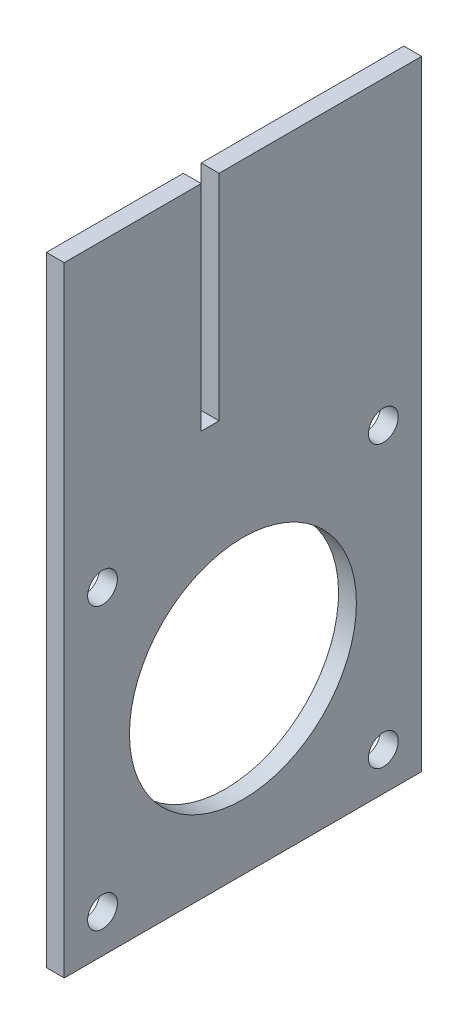
ISO-10303-21;
HEADER;
FILE_DESCRIPTION(('STEP AP214'),'2;1');
FILE_NAME('part.step','',(''),(''),'','','');
FILE_SCHEMA(('AUTOMOTIVE_DESIGN { 1 0 10303 214 1 1 1 1 }'));
ENDSEC;
DATA;
#1=APPLICATION_CONTEXT('core data for automotive mechanical design processes');
#2=APPLICATION_PROTOCOL_DEFINITION('international standard','automotive_design',2000,#1);
#3=PRODUCT_CONTEXT('',#1,'mechanical');
#4=PRODUCT('Part','Part','',(#3));
#5=PRODUCT_RELATED_PRODUCT_CATEGORY('part','',(#4));
#6=PRODUCT_DEFINITION_FORMATION('','',#4);
#7=PRODUCT_DEFINITION_CONTEXT('part definition',#1,'design');
#8=PRODUCT_DEFINITION('design','',#6,#7);
#9=PRODUCT_DEFINITION_SHAPE('','',#8);
#10=(LENGTH_UNIT() NAMED_UNIT(*) SI_UNIT(.MILLI.,.METRE.));
#11=(NAMED_UNIT(*) PLANE_ANGLE_UNIT() SI_UNIT($,.RADIAN.));
#12=(NAMED_UNIT(*) SI_UNIT($,.STERADIAN.) SOLID_ANGLE_UNIT());
#13=UNCERTAINTY_MEASURE_WITH_UNIT(LENGTH_MEASURE(1.E-05),#10,'distance_accuracy_value','');
#14=(GEOMETRIC_REPRESENTATION_CONTEXT(3) GLOBAL_UNCERTAINTY_ASSIGNED_CONTEXT((#13)) GLOBAL_UNIT_ASSIGNED_CONTEXT((#10,
#11,#12)) REPRESENTATION_CONTEXT('',''));
#15=CARTESIAN_POINT('',(0.,0.,0.));
#16=DIRECTION('',(0.,0.,1.));
#17=DIRECTION('',(1.,0.,0.));
#18=AXIS2_PLACEMENT_3D('',#15,#16,#17);
#19=CARTESIAN_POINT('',(-3.,104.,60.));
#20=DIRECTION('',(0.,1.,0.));
#21=DIRECTION('',(0.,0.,1.));
#22=AXIS2_PLACEMENT_3D('',#19,#20,#21);
#23=PLANE('',#22);
#24=DIRECTION('',(1.,0.,0.));
#25=VECTOR('',#24,1.);
#26=CARTESIAN_POINT('',(-3.,104.,37.));
#27=LINE('',#26,#25);
#28=CARTESIAN_POINT('',(-3.,104.,37.));
#29=VERTEX_POINT('',#28);
#30=CARTESIAN_POINT('',(0.,104.,37.));
#31=VERTEX_POINT('',#30);
#32=EDGE_CURVE('E50',#29,#31,#27,.T.);
#33=ORIENTED_EDGE('',*,*,#32,.F.);
#34=DIRECTION('',(0.,0.,-1.));
#35=VECTOR('',#34,1.);
#36=CARTESIAN_POINT('',(-3.,104.,60.));
#37=LINE('',#36,#35);
#38=CARTESIAN_POINT('',(-3.,104.,60.));
#39=VERTEX_POINT('',#38);
#40=EDGE_CURVE('E66',#39,#29,#37,.T.);
#41=ORIENTED_EDGE('',*,*,#40,.F.);
#42=DIRECTION('',(1.,0.,0.));
#43=VECTOR('',#42,1.);
#44=CARTESIAN_POINT('',(-3.,104.,60.));
#45=LINE('',#44,#43);
#46=CARTESIAN_POINT('',(0.,104.,60.));
#47=VERTEX_POINT('',#46);
#48=EDGE_CURVE('E134',#39,#47,#45,.T.);
#49=ORIENTED_EDGE('',*,*,#48,.T.);
#50=DIRECTION('',(0.,0.,-1.));
#51=VECTOR('',#50,1.);
#52=CARTESIAN_POINT('',(0.,104.,60.));
#53=LINE('',#52,#51);
#54=EDGE_CURVE('E129',#47,#31,#53,.T.);
#55=ORIENTED_EDGE('',*,*,#54,.T.);
#56=EDGE_LOOP('',(#33,#41,#49,#55));
#57=FACE_BOUND('',#56,.T.);
#58=ADVANCED_FACE('F42',(#57),#23,.T.);
#59=CARTESIAN_POINT('',(-3.,104.,60.));
#60=DIRECTION('',(1.,0.,0.));
#61=DIRECTION('',(0.,1.,0.));
#62=AXIS2_PLACEMENT_3D('',#59,#60,#61);
#63=PLANE('',#62);
#64=CARTESIAN_POINT('',(-3.,53.5699999999998,53.5700000000003));
#65=DIRECTION('',(-1.,0.,0.));
#66=DIRECTION('',(0.,-1.,0.));
#67=AXIS2_PLACEMENT_3D('',#64,#65,#66);
#68=CIRCLE('',#67,2.49999999999998);
#69=CARTESIAN_POINT('',(-3.,51.0699999999998,53.5700000000003));
#70=VERTEX_POINT('',#69);
#71=EDGE_CURVE('E190',#70,#70,#68,.T.);
#72=ORIENTED_EDGE('',*,*,#71,.F.);
#73=EDGE_LOOP('',(#72));
#74=FACE_BOUND('',#73,.T.);
#75=CARTESIAN_POINT('',(-3.,6.43000000000001,53.5700000000002));
#76=DIRECTION('',(-1.,0.,0.));
#77=DIRECTION('',(0.,-1.,0.));
#78=AXIS2_PLACEMENT_3D('',#75,#76,#77);
#79=CIRCLE('',#78,2.49999999999998);
#80=CARTESIAN_POINT('',(-3.,3.93000000000002,53.5700000000002));
#81=VERTEX_POINT('',#80);
#82=EDGE_CURVE('E193',#81,#81,#79,.T.);
#83=ORIENTED_EDGE('',*,*,#82,.F.);
#84=EDGE_LOOP('',(#83));
#85=FACE_BOUND('',#84,.T.);
#86=CARTESIAN_POINT('',(-3.,53.5699999999999,6.43000000000035));
#87=DIRECTION('',(-1.,0.,0.));
#88=DIRECTION('',(0.,-1.,0.));
#89=AXIS2_PLACEMENT_3D('',#86,#87,#88);
#90=CIRCLE('',#89,2.49999999999998);
#91=CARTESIAN_POINT('',(-3.,51.0699999999999,6.43000000000035));
#92=VERTEX_POINT('',#91);
#93=EDGE_CURVE('E197',#92,#92,#90,.T.);
#94=ORIENTED_EDGE('',*,*,#93,.F.);
#95=EDGE_LOOP('',(#94));
#96=FACE_BOUND('',#95,.T.);
#97=CARTESIAN_POINT('',(-3.,29.9999999999998,30.0000000000002));
#98=DIRECTION('',(-1.,0.,0.));
#99=DIRECTION('',(0.,-1.,0.));
#100=AXIS2_PLACEMENT_3D('',#97,#98,#99);
#101=CIRCLE('',#100,19.05);
#102=CARTESIAN_POINT('',(-3.,10.9499999999999,30.0000000000002));
#103=VERTEX_POINT('',#102);
#104=EDGE_CURVE('E189',#103,#103,#101,.T.);
#105=ORIENTED_EDGE('',*,*,#104,.F.);
#106=EDGE_LOOP('',(#105));
#107=FACE_BOUND('',#106,.T.);
#108=CARTESIAN_POINT('',(-3.,6.43,6.43000000000018));
#109=DIRECTION('',(-1.,0.,0.));
#110=DIRECTION('',(0.,-1.,0.));
#111=AXIS2_PLACEMENT_3D('',#108,#109,#110);
#112=CIRCLE('',#111,2.49999999999998);
#113=CARTESIAN_POINT('',(-3.,3.93000000000002,6.43000000000018));
#114=VERTEX_POINT('',#113);
#115=EDGE_CURVE('E147',#114,#114,#112,.T.);
#116=ORIENTED_EDGE('',*,*,#115,.F.);
#117=EDGE_LOOP('',(#116));
#118=FACE_BOUND('',#117,.T.);
#119=ORIENTED_EDGE('',*,*,#40,.T.);
#120=DIRECTION('',(0.,1.,0.));
#121=VECTOR('',#120,1.);
#122=CARTESIAN_POINT('',(-3.,68.,37.));
#123=LINE('',#122,#121);
#124=CARTESIAN_POINT('',(-3.,68.,37.));
#125=VERTEX_POINT('',#124);
#126=EDGE_CURVE('E119',#125,#29,#123,.T.);
#127=ORIENTED_EDGE('',*,*,#126,.F.);
#128=DIRECTION('',(0.,0.,1.));
#129=VECTOR('',#128,1.);
#130=CARTESIAN_POINT('',(-3.,68.,34.));
#131=LINE('',#130,#129);
#132=CARTESIAN_POINT('',(-3.,68.,34.));
#133=VERTEX_POINT('',#132);
#134=EDGE_CURVE('E126',#133,#125,#131,.T.);
#135=ORIENTED_EDGE('',*,*,#134,.F.);
#136=DIRECTION('',(0.,-1.,0.));
#137=VECTOR('',#136,1.);
#138=CARTESIAN_POINT('',(-3.,104.,34.));
#139=LINE('',#138,#137);
#140=CARTESIAN_POINT('',(-3.,104.,34.));
#141=VERTEX_POINT('',#140);
#142=EDGE_CURVE('E162',#141,#133,#139,.T.);
#143=ORIENTED_EDGE('',*,*,#142,.F.);
#144=CARTESIAN_POINT('',(-3.,104.,0.));
#145=VERTEX_POINT('',#144);
#146=EDGE_CURVE('E89',#141,#145,#37,.T.);
#147=ORIENTED_EDGE('',*,*,#146,.T.);
#148=DIRECTION('',(0.,-1.,0.));
#149=VECTOR('',#148,1.);
#150=CARTESIAN_POINT('',(-3.,104.,0.));
#151=LINE('',#150,#149);
#152=CARTESIAN_POINT('',(-3.,0.,0.));
#153=VERTEX_POINT('',#152);
#154=EDGE_CURVE('E159',#145,#153,#151,.T.);
#155=ORIENTED_EDGE('',*,*,#154,.T.);
#156=DIRECTION('',(0.,0.,-1.));
#157=VECTOR('',#156,1.);
#158=CARTESIAN_POINT('',(-3.,0.,60.));
#159=LINE('',#158,#157);
#160=CARTESIAN_POINT('',(-3.,0.,60.));
#161=VERTEX_POINT('',#160);
#162=EDGE_CURVE('E141',#161,#153,#159,.T.);
#163=ORIENTED_EDGE('',*,*,#162,.F.);
#164=DIRECTION('',(0.,-1.,0.));
#165=VECTOR('',#164,1.);
#166=CARTESIAN_POINT('',(-3.,104.,60.));
#167=LINE('',#166,#165);
#168=EDGE_CURVE('E96',#39,#161,#167,.T.);
#169=ORIENTED_EDGE('',*,*,#168,.F.);
#170=EDGE_LOOP('',(#119,#127,#135,#143,#147,#155,#163,#169));
#171=FACE_BOUND('',#170,.T.);
#172=ADVANCED_FACE('F44',(#74,#85,#96,#107,#118,#171),#63,.F.);
#173=CARTESIAN_POINT('',(0.,0.,60.));
#174=DIRECTION('',(0.,-1.,0.));
#175=DIRECTION('',(0.,0.,-1.));
#176=AXIS2_PLACEMENT_3D('',#173,#174,#175);
#177=PLANE('',#176);
#178=DIRECTION('',(-1.,0.,0.));
#179=VECTOR('',#178,1.);
#180=CARTESIAN_POINT('',(0.,0.,0.));
#181=LINE('',#180,#179);
#182=CARTESIAN_POINT('',(0.,0.,0.));
#183=VERTEX_POINT('',#182);
#184=EDGE_CURVE('E176',#183,#153,#181,.T.);
#185=ORIENTED_EDGE('',*,*,#184,.F.);
#186=DIRECTION('',(0.,0.,-1.));
#187=VECTOR('',#186,1.);
#188=CARTESIAN_POINT('',(0.,0.,60.));
#189=LINE('',#188,#187);
#190=CARTESIAN_POINT('',(0.,0.,60.));
#191=VERTEX_POINT('',#190);
#192=EDGE_CURVE('E139',#191,#183,#189,.T.);
#193=ORIENTED_EDGE('',*,*,#192,.F.);
#194=DIRECTION('',(-1.,0.,0.));
#195=VECTOR('',#194,1.);
#196=CARTESIAN_POINT('',(0.,0.,60.));
#197=LINE('',#196,#195);
#198=EDGE_CURVE('E174',#191,#161,#197,.T.);
#199=ORIENTED_EDGE('',*,*,#198,.T.);
#200=ORIENTED_EDGE('',*,*,#162,.T.);
#201=EDGE_LOOP('',(#185,#193,#199,#200));
#202=FACE_BOUND('',#201,.T.);
#203=ADVANCED_FACE('F215',(#202),#177,.T.);
#204=CARTESIAN_POINT('',(0.,104.,60.));
#205=DIRECTION('',(1.,0.,0.));
#206=DIRECTION('',(0.,1.,0.));
#207=AXIS2_PLACEMENT_3D('',#204,#205,#206);
#208=PLANE('',#207);
#209=DIRECTION('',(0.,-1.,0.));
#210=VECTOR('',#209,1.);
#211=CARTESIAN_POINT('',(0.,104.,37.));
#212=LINE('',#211,#210);
#213=CARTESIAN_POINT('',(0.,68.,37.));
#214=VERTEX_POINT('',#213);
#215=EDGE_CURVE('E194',#31,#214,#212,.T.);
#216=ORIENTED_EDGE('',*,*,#215,.F.);
#217=ORIENTED_EDGE('',*,*,#54,.F.);
#218=DIRECTION('',(0.,-1.,0.));
#219=VECTOR('',#218,1.);
#220=CARTESIAN_POINT('',(0.,104.,60.));
#221=LINE('',#220,#219);
#222=EDGE_CURVE('E182',#47,#191,#221,.T.);
#223=ORIENTED_EDGE('',*,*,#222,.T.);
#224=ORIENTED_EDGE('',*,*,#192,.T.);
#225=DIRECTION('',(0.,-1.,0.));
#226=VECTOR('',#225,1.);
#227=CARTESIAN_POINT('',(0.,104.,0.));
#228=LINE('',#227,#226);
#229=CARTESIAN_POINT('',(0.,104.,0.));
#230=VERTEX_POINT('',#229);
#231=EDGE_CURVE('E173',#230,#183,#228,.T.);
#232=ORIENTED_EDGE('',*,*,#231,.F.);
#233=CARTESIAN_POINT('',(0.,104.,34.));
#234=VERTEX_POINT('',#233);
#235=EDGE_CURVE('E131',#234,#230,#53,.T.);
#236=ORIENTED_EDGE('',*,*,#235,.F.);
#237=DIRECTION('',(0.,1.,0.));
#238=VECTOR('',#237,1.);
#239=CARTESIAN_POINT('',(0.,104.,34.));
#240=LINE('',#239,#238);
#241=CARTESIAN_POINT('',(0.,68.,34.));
#242=VERTEX_POINT('',#241);
#243=EDGE_CURVE('E57',#242,#234,#240,.T.);
#244=ORIENTED_EDGE('',*,*,#243,.F.);
#245=DIRECTION('',(0.,0.,-1.));
#246=VECTOR('',#245,1.);
#247=CARTESIAN_POINT('',(0.,68.,60.));
#248=LINE('',#247,#246);
#249=EDGE_CURVE('E11',#214,#242,#248,.T.);
#250=ORIENTED_EDGE('',*,*,#249,.F.);
#251=EDGE_LOOP('',(#216,#217,#223,#224,#232,#236,#244,#250));
#252=FACE_BOUND('',#251,.T.);
#253=CARTESIAN_POINT('',(0.,53.5699999999998,53.5700000000003));
#254=DIRECTION('',(1.,0.,0.));
#255=DIRECTION('',(0.,1.,0.));
#256=AXIS2_PLACEMENT_3D('',#253,#254,#255);
#257=CIRCLE('',#256,2.49999999999998);
#258=CARTESIAN_POINT('',(0.,56.0699999999997,53.5700000000003));
#259=VERTEX_POINT('',#258);
#260=EDGE_CURVE('E156',#259,#259,#257,.T.);
#261=ORIENTED_EDGE('',*,*,#260,.F.);
#262=EDGE_LOOP('',(#261));
#263=FACE_BOUND('',#262,.T.);
#264=CARTESIAN_POINT('',(0.,6.43000000000001,53.5700000000002));
#265=DIRECTION('',(1.,0.,0.));
#266=DIRECTION('',(0.,1.,0.));
#267=AXIS2_PLACEMENT_3D('',#264,#265,#266);
#268=CIRCLE('',#267,2.49999999999998);
#269=CARTESIAN_POINT('',(0.,8.92999999999999,53.5700000000002));
#270=VERTEX_POINT('',#269);
#271=EDGE_CURVE('E153',#270,#270,#268,.T.);
#272=ORIENTED_EDGE('',*,*,#271,.F.);
#273=EDGE_LOOP('',(#272));
#274=FACE_BOUND('',#273,.T.);
#275=CARTESIAN_POINT('',(0.,53.5699999999999,6.43000000000035));
#276=DIRECTION('',(1.,0.,0.));
#277=DIRECTION('',(0.,1.,0.));
#278=AXIS2_PLACEMENT_3D('',#275,#276,#277);
#279=CIRCLE('',#278,2.49999999999998);
#280=CARTESIAN_POINT('',(0.,56.0699999999999,6.43000000000035));
#281=VERTEX_POINT('',#280);
#282=EDGE_CURVE('E150',#281,#281,#279,.T.);
#283=ORIENTED_EDGE('',*,*,#282,.F.);
#284=EDGE_LOOP('',(#283));
#285=FACE_BOUND('',#284,.T.);
#286=CARTESIAN_POINT('',(0.,29.9999999999998,30.0000000000002));
#287=DIRECTION('',(1.,0.,0.));
#288=DIRECTION('',(0.,1.,0.));
#289=AXIS2_PLACEMENT_3D('',#286,#287,#288);
#290=CIRCLE('',#289,19.05);
#291=CARTESIAN_POINT('',(0.,49.0499999999998,30.0000000000002));
#292=VERTEX_POINT('',#291);
#293=EDGE_CURVE('E146',#292,#292,#290,.T.);
#294=ORIENTED_EDGE('',*,*,#293,.F.);
#295=EDGE_LOOP('',(#294));
#296=FACE_BOUND('',#295,.T.);
#297=CARTESIAN_POINT('',(0.,6.43,6.43000000000018));
#298=DIRECTION('',(1.,0.,0.));
#299=DIRECTION('',(0.,1.,0.));
#300=AXIS2_PLACEMENT_3D('',#297,#298,#299);
#301=CIRCLE('',#300,2.49999999999998);
#302=CARTESIAN_POINT('',(0.,8.92999999999998,6.43000000000018));
#303=VERTEX_POINT('',#302);
#304=EDGE_CURVE('E143',#303,#303,#301,.T.);
#305=ORIENTED_EDGE('',*,*,#304,.F.);
#306=EDGE_LOOP('',(#305));
#307=FACE_BOUND('',#306,.T.);
#308=ADVANCED_FACE('F210',(#252,#263,#274,#285,#296,#307),#208,.T.);
#309=DIRECTION('',(-1.,0.,0.));
#310=VECTOR('',#309,1.);
#311=CARTESIAN_POINT('',(-3.,104.,34.));
#312=LINE('',#311,#310);
#313=EDGE_CURVE('E130',#234,#141,#312,.T.);
#314=ORIENTED_EDGE('',*,*,#313,.F.);
#315=ORIENTED_EDGE('',*,*,#235,.T.);
#316=DIRECTION('',(1.,0.,0.));
#317=VECTOR('',#316,1.);
#318=CARTESIAN_POINT('',(-3.,104.,0.));
#319=LINE('',#318,#317);
#320=EDGE_CURVE('E136',#145,#230,#319,.T.);
#321=ORIENTED_EDGE('',*,*,#320,.F.);
#322=ORIENTED_EDGE('',*,*,#146,.F.);
#323=EDGE_LOOP('',(#314,#315,#321,#322));
#324=FACE_BOUND('',#323,.T.);
#325=ADVANCED_FACE('F168',(#324),#23,.T.);
#326=CARTESIAN_POINT('',(0.,0.,60.));
#327=DIRECTION('',(0.,0.,-1.));
#328=DIRECTION('',(-1.,0.,0.));
#329=AXIS2_PLACEMENT_3D('',#326,#327,#328);
#330=PLANE('',#329);
#331=ORIENTED_EDGE('',*,*,#168,.T.);
#332=ORIENTED_EDGE('',*,*,#198,.F.);
#333=ORIENTED_EDGE('',*,*,#222,.F.);
#334=ORIENTED_EDGE('',*,*,#48,.F.);
#335=EDGE_LOOP('',(#331,#332,#333,#334));
#336=FACE_BOUND('',#335,.T.);
#337=ADVANCED_FACE('F217',(#336),#330,.F.);
#338=CARTESIAN_POINT('',(0.,0.,0.));
#339=DIRECTION('',(0.,0.,-1.));
#340=DIRECTION('',(-1.,0.,0.));
#341=AXIS2_PLACEMENT_3D('',#338,#339,#340);
#342=PLANE('',#341);
#343=ORIENTED_EDGE('',*,*,#154,.F.);
#344=ORIENTED_EDGE('',*,*,#320,.T.);
#345=ORIENTED_EDGE('',*,*,#231,.T.);
#346=ORIENTED_EDGE('',*,*,#184,.T.);
#347=EDGE_LOOP('',(#343,#344,#345,#346));
#348=FACE_BOUND('',#347,.T.);
#349=ADVANCED_FACE('F216',(#348),#342,.T.);
#350=CARTESIAN_POINT('',(7.,6.43,6.43000000000018));
#351=DIRECTION('',(-1.,0.,0.));
#352=DIRECTION('',(0.,-1.,0.));
#353=AXIS2_PLACEMENT_3D('',#350,#351,#352);
#354=CYLINDRICAL_SURFACE('',#353,2.49999999999998);
#355=ORIENTED_EDGE('',*,*,#304,.T.);
#356=EDGE_LOOP('',(#355));
#357=FACE_BOUND('',#356,.T.);
#358=ORIENTED_EDGE('',*,*,#115,.T.);
#359=EDGE_LOOP('',(#358));
#360=FACE_BOUND('',#359,.T.);
#361=ADVANCED_FACE('F224',(#357,#360),#354,.F.);
#362=CARTESIAN_POINT('',(7.,29.9999999999998,30.0000000000002));
#363=DIRECTION('',(-1.,0.,0.));
#364=DIRECTION('',(0.,-1.,0.));
#365=AXIS2_PLACEMENT_3D('',#362,#363,#364);
#366=CYLINDRICAL_SURFACE('',#365,19.05);
#367=ORIENTED_EDGE('',*,*,#293,.T.);
#368=EDGE_LOOP('',(#367));
#369=FACE_BOUND('',#368,.T.);
#370=ORIENTED_EDGE('',*,*,#104,.T.);
#371=EDGE_LOOP('',(#370));
#372=FACE_BOUND('',#371,.T.);
#373=ADVANCED_FACE('F324',(#369,#372),#366,.F.);
#374=CARTESIAN_POINT('',(7.,53.5699999999999,6.43000000000035));
#375=DIRECTION('',(-1.,0.,0.));
#376=DIRECTION('',(0.,-1.,0.));
#377=AXIS2_PLACEMENT_3D('',#374,#375,#376);
#378=CYLINDRICAL_SURFACE('',#377,2.49999999999998);
#379=ORIENTED_EDGE('',*,*,#282,.T.);
#380=EDGE_LOOP('',(#379));
#381=FACE_BOUND('',#380,.T.);
#382=ORIENTED_EDGE('',*,*,#93,.T.);
#383=EDGE_LOOP('',(#382));
#384=FACE_BOUND('',#383,.T.);
#385=ADVANCED_FACE('F314',(#381,#384),#378,.F.);
#386=CARTESIAN_POINT('',(7.,6.43000000000001,53.5700000000002));
#387=DIRECTION('',(-1.,0.,0.));
#388=DIRECTION('',(0.,-1.,0.));
#389=AXIS2_PLACEMENT_3D('',#386,#387,#388);
#390=CYLINDRICAL_SURFACE('',#389,2.49999999999998);
#391=ORIENTED_EDGE('',*,*,#271,.T.);
#392=EDGE_LOOP('',(#391));
#393=FACE_BOUND('',#392,.T.);
#394=ORIENTED_EDGE('',*,*,#82,.T.);
#395=EDGE_LOOP('',(#394));
#396=FACE_BOUND('',#395,.T.);
#397=ADVANCED_FACE('F304',(#393,#396),#390,.F.);
#398=CARTESIAN_POINT('',(7.,53.5699999999998,53.5700000000003));
#399=DIRECTION('',(-1.,0.,0.));
#400=DIRECTION('',(0.,-1.,0.));
#401=AXIS2_PLACEMENT_3D('',#398,#399,#400);
#402=CYLINDRICAL_SURFACE('',#401,2.49999999999998);
#403=ORIENTED_EDGE('',*,*,#260,.T.);
#404=EDGE_LOOP('',(#403));
#405=FACE_BOUND('',#404,.T.);
#406=ORIENTED_EDGE('',*,*,#71,.T.);
#407=EDGE_LOOP('',(#406));
#408=FACE_BOUND('',#407,.T.);
#409=ADVANCED_FACE('F259',(#405,#408),#402,.F.);
#410=CARTESIAN_POINT('',(7.,68.,37.));
#411=DIRECTION('',(0.,0.,1.));
#412=DIRECTION('',(1.,0.,0.));
#413=AXIS2_PLACEMENT_3D('',#410,#411,#412);
#414=PLANE('',#413);
#415=ORIENTED_EDGE('',*,*,#215,.T.);
#416=DIRECTION('',(-1.,0.,0.));
#417=VECTOR('',#416,1.);
#418=CARTESIAN_POINT('',(7.,68.,37.));
#419=LINE('',#418,#417);
#420=EDGE_CURVE('E123',#214,#125,#419,.T.);
#421=ORIENTED_EDGE('',*,*,#420,.T.);
#422=ORIENTED_EDGE('',*,*,#126,.T.);
#423=ORIENTED_EDGE('',*,*,#32,.T.);
#424=EDGE_LOOP('',(#415,#421,#422,#423));
#425=FACE_BOUND('',#424,.T.);
#426=ADVANCED_FACE('F120',(#425),#414,.F.);
#427=CARTESIAN_POINT('',(7.,68.,34.));
#428=DIRECTION('',(0.,-1.,0.));
#429=DIRECTION('',(1.,0.,0.));
#430=AXIS2_PLACEMENT_3D('',#427,#428,#429);
#431=PLANE('',#430);
#432=ORIENTED_EDGE('',*,*,#249,.T.);
#433=DIRECTION('',(-1.,0.,0.));
#434=VECTOR('',#433,1.);
#435=CARTESIAN_POINT('',(7.,68.,34.));
#436=LINE('',#435,#434);
#437=EDGE_CURVE('E165',#242,#133,#436,.T.);
#438=ORIENTED_EDGE('',*,*,#437,.T.);
#439=ORIENTED_EDGE('',*,*,#134,.T.);
#440=ORIENTED_EDGE('',*,*,#420,.F.);
#441=EDGE_LOOP('',(#432,#438,#439,#440));
#442=FACE_BOUND('',#441,.T.);
#443=ADVANCED_FACE('F207',(#442),#431,.F.);
#444=CARTESIAN_POINT('',(7.,104.,34.));
#445=DIRECTION('',(0.,0.,-1.));
#446=DIRECTION('',(0.,1.,0.));
#447=AXIS2_PLACEMENT_3D('',#444,#445,#446);
#448=PLANE('',#447);
#449=ORIENTED_EDGE('',*,*,#243,.T.);
#450=ORIENTED_EDGE('',*,*,#313,.T.);
#451=ORIENTED_EDGE('',*,*,#142,.T.);
#452=ORIENTED_EDGE('',*,*,#437,.F.);
#453=EDGE_LOOP('',(#449,#450,#451,#452));
#454=FACE_BOUND('',#453,.T.);
#455=ADVANCED_FACE('F161',(#454),#448,.F.);
#456=CLOSED_SHELL('',(#58,#172,#203,#308,#325,#337,#349,#361,#373,#385,#397,#409,#426,#443,#455));
#457=MANIFOLD_SOLID_BREP('B2',#456);
#458=ADVANCED_BREP_SHAPE_REPRESENTATION('',(#18,#457),#14);
#459=SHAPE_DEFINITION_REPRESENTATION(#9,#458);
ENDSEC;
END-ISO-10303-21;
